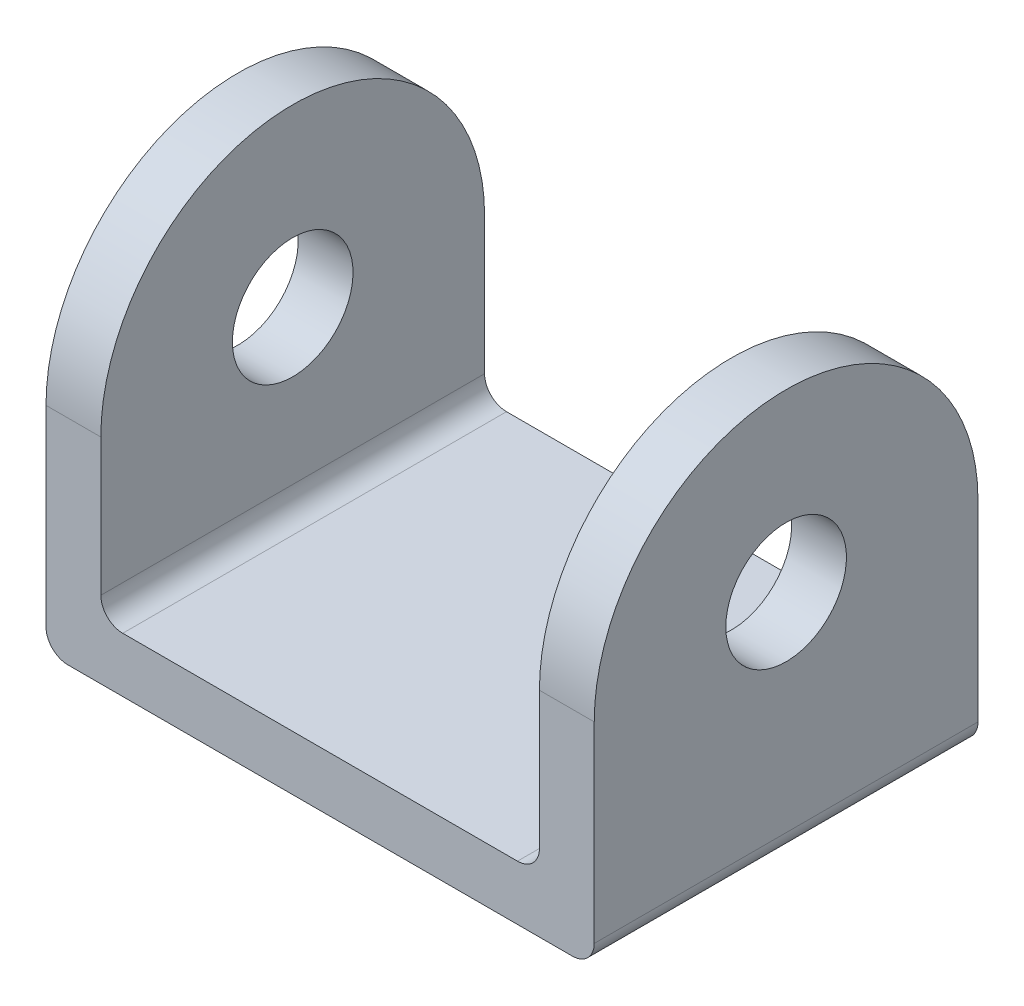
ISO-10303-21;
HEADER;
FILE_DESCRIPTION(('STEP AP214'),'2;1');
FILE_NAME('part.step','',(''),(''),'','','');
FILE_SCHEMA(('AUTOMOTIVE_DESIGN { 1 0 10303 214 1 1 1 1 }'));
ENDSEC;
DATA;
#1=APPLICATION_CONTEXT('core data for automotive mechanical design processes');
#2=APPLICATION_PROTOCOL_DEFINITION('international standard','automotive_design',2000,#1);
#3=PRODUCT_CONTEXT('',#1,'mechanical');
#4=PRODUCT('Part','Part','',(#3));
#5=PRODUCT_RELATED_PRODUCT_CATEGORY('part','',(#4));
#6=PRODUCT_DEFINITION_FORMATION('','',#4);
#7=PRODUCT_DEFINITION_CONTEXT('part definition',#1,'design');
#8=PRODUCT_DEFINITION('design','',#6,#7);
#9=PRODUCT_DEFINITION_SHAPE('','',#8);
#10=(LENGTH_UNIT() NAMED_UNIT(*) SI_UNIT(.MILLI.,.METRE.));
#11=(NAMED_UNIT(*) PLANE_ANGLE_UNIT() SI_UNIT($,.RADIAN.));
#12=(NAMED_UNIT(*) SI_UNIT($,.STERADIAN.) SOLID_ANGLE_UNIT());
#13=UNCERTAINTY_MEASURE_WITH_UNIT(LENGTH_MEASURE(1.E-05),#10,'distance_accuracy_value','');
#14=(GEOMETRIC_REPRESENTATION_CONTEXT(3) GLOBAL_UNCERTAINTY_ASSIGNED_CONTEXT((#13)) GLOBAL_UNIT_ASSIGNED_CONTEXT((#10,
#11,#12)) REPRESENTATION_CONTEXT('',''));
#15=CARTESIAN_POINT('',(0.,0.,0.));
#16=DIRECTION('',(0.,0.,1.));
#17=DIRECTION('',(1.,0.,0.));
#18=AXIS2_PLACEMENT_3D('',#15,#16,#17);
#19=CARTESIAN_POINT('',(-10.5198186826512,5.35080430037993,35.));
#20=DIRECTION('',(-1.,0.,0.));
#21=DIRECTION('',(0.,0.,1.));
#22=AXIS2_PLACEMENT_3D('',#19,#20,#21);
#23=PLANE('',#22);
#24=CARTESIAN_POINT('',(-10.5198186826512,19.3508043003799,17.5000000000001));
#25=DIRECTION('',(-1.,0.,0.));
#26=DIRECTION('',(0.,0.,1.));
#27=AXIS2_PLACEMENT_3D('',#24,#25,#26);
#28=CIRCLE('',#27,5.49999999999999);
#29=CARTESIAN_POINT('',(-10.5198186826512,19.3508043003799,23.0000000000001));
#30=VERTEX_POINT('',#29);
#31=EDGE_CURVE('E143',#30,#30,#28,.T.);
#32=ORIENTED_EDGE('',*,*,#31,.F.);
#33=EDGE_LOOP('',(#32));
#34=FACE_BOUND('',#33,.T.);
#35=DIRECTION('',(0.,1.,0.));
#36=VECTOR('',#35,1.);
#37=CARTESIAN_POINT('',(-10.5198186826512,5.35080430037993,35.));
#38=LINE('',#37,#36);
#39=CARTESIAN_POINT('',(-10.5198186826512,5.35080430037991,35.));
#40=VERTEX_POINT('',#39);
#41=CARTESIAN_POINT('',(-10.5198186826511,17.8508043003799,35.));
#42=VERTEX_POINT('',#41);
#43=EDGE_CURVE('E162',#40,#42,#38,.T.);
#44=ORIENTED_EDGE('',*,*,#43,.T.);
#45=CARTESIAN_POINT('',(-10.5198186826511,17.8508043003799,17.5));
#46=DIRECTION('',(-1.,0.,0.));
#47=DIRECTION('',(0.,0.,1.));
#48=AXIS2_PLACEMENT_3D('',#45,#46,#47);
#49=CIRCLE('',#48,17.5);
#50=CARTESIAN_POINT('',(-10.5198186826512,17.8508043003799,0.));
#51=VERTEX_POINT('',#50);
#52=EDGE_CURVE('E50',#42,#51,#49,.T.);
#53=ORIENTED_EDGE('',*,*,#52,.T.);
#54=DIRECTION('',(0.,1.,0.));
#55=VECTOR('',#54,1.);
#56=CARTESIAN_POINT('',(-10.5198186826512,5.35080430037993,0.));
#57=LINE('',#56,#55);
#58=CARTESIAN_POINT('',(-10.5198186826512,5.35080430037991,0.));
#59=VERTEX_POINT('',#58);
#60=EDGE_CURVE('E139',#59,#51,#57,.T.);
#61=ORIENTED_EDGE('',*,*,#60,.F.);
#62=DIRECTION('',(0.,0.,-1.));
#63=VECTOR('',#62,1.);
#64=CARTESIAN_POINT('',(-10.5198186826512,5.35080430037991,35.));
#65=LINE('',#64,#63);
#66=EDGE_CURVE('E11',#40,#59,#65,.T.);
#67=ORIENTED_EDGE('',*,*,#66,.F.);
#68=EDGE_LOOP('',(#44,#53,#61,#67));
#69=FACE_BOUND('',#68,.T.);
#70=ADVANCED_FACE('F34',(#34,#69),#23,.T.);
#71=CARTESIAN_POINT('',(-7.51981868265115,0.350804300379914,35.));
#72=DIRECTION('',(0.,0.,1.));
#73=DIRECTION('',(1.,0.,0.));
#74=AXIS2_PLACEMENT_3D('',#71,#72,#73);
#75=PLANE('',#74);
#76=DIRECTION('',(0.,1.,0.));
#77=VECTOR('',#76,1.);
#78=CARTESIAN_POINT('',(-5.51981868265115,0.350804300379929,35.));
#79=LINE('',#78,#77);
#80=CARTESIAN_POINT('',(-5.51981868265115,0.350804300379929,35.));
#81=VERTEX_POINT('',#80);
#82=CARTESIAN_POINT('',(-5.51981868265114,17.8508043003799,35.));
#83=VERTEX_POINT('',#82);
#84=EDGE_CURVE('E182',#81,#83,#79,.T.);
#85=ORIENTED_EDGE('',*,*,#84,.T.);
#86=DIRECTION('',(-1.,0.,0.));
#87=VECTOR('',#86,1.);
#88=CARTESIAN_POINT('',(139.945510717627,17.8508043003799,35.));
#89=LINE('',#88,#87);
#90=EDGE_CURVE('E193',#83,#42,#89,.T.);
#91=ORIENTED_EDGE('',*,*,#90,.T.);
#92=ORIENTED_EDGE('',*,*,#43,.F.);
#93=CARTESIAN_POINT('',(-12.5198186826512,5.35080430037991,35.));
#94=DIRECTION('',(0.,0.,1.));
#95=DIRECTION('',(1.,0.,0.));
#96=AXIS2_PLACEMENT_3D('',#93,#94,#95);
#97=CIRCLE('',#96,2.);
#98=CARTESIAN_POINT('',(-12.5198186826512,3.35080430037991,35.));
#99=VERTEX_POINT('',#98);
#100=EDGE_CURVE('E134',#99,#40,#97,.T.);
#101=ORIENTED_EDGE('',*,*,#100,.F.);
#102=DIRECTION('',(1.,0.,0.));
#103=VECTOR('',#102,1.);
#104=CARTESIAN_POINT('',(-48.5198186826511,3.35080430037991,35.));
#105=LINE('',#104,#103);
#106=CARTESIAN_POINT('',(-48.5198186826511,3.35080430037991,35.));
#107=VERTEX_POINT('',#106);
#108=EDGE_CURVE('E116',#107,#99,#105,.T.);
#109=ORIENTED_EDGE('',*,*,#108,.F.);
#110=CARTESIAN_POINT('',(-48.5198186826511,5.35080430037991,35.));
#111=DIRECTION('',(0.,0.,-1.));
#112=DIRECTION('',(-1.,0.,0.));
#113=AXIS2_PLACEMENT_3D('',#110,#111,#112);
#114=CIRCLE('',#113,2.);
#115=CARTESIAN_POINT('',(-50.5198186826511,5.35080430037993,35.));
#116=VERTEX_POINT('',#115);
#117=EDGE_CURVE('E127',#107,#116,#114,.T.);
#118=ORIENTED_EDGE('',*,*,#117,.T.);
#119=DIRECTION('',(0.,-1.,0.));
#120=VECTOR('',#119,1.);
#121=CARTESIAN_POINT('',(-50.5198186826512,35.3508043003799,35.));
#122=LINE('',#121,#120);
#123=CARTESIAN_POINT('',(-50.5198186826513,17.8508043003799,35.));
#124=VERTEX_POINT('',#123);
#125=EDGE_CURVE('E131',#124,#116,#122,.T.);
#126=ORIENTED_EDGE('',*,*,#125,.F.);
#127=DIRECTION('',(1.,0.,0.));
#128=VECTOR('',#127,1.);
#129=CARTESIAN_POINT('',(-200.985148082929,17.8508043003799,35.));
#130=LINE('',#129,#128);
#131=CARTESIAN_POINT('',(-55.5198186826512,17.8508043003799,35.));
#132=VERTEX_POINT('',#131);
#133=EDGE_CURVE('E204',#132,#124,#130,.T.);
#134=ORIENTED_EDGE('',*,*,#133,.F.);
#135=DIRECTION('',(0.,-1.,0.));
#136=VECTOR('',#135,1.);
#137=CARTESIAN_POINT('',(-55.5198186826512,35.3508043003799,35.));
#138=LINE('',#137,#136);
#139=CARTESIAN_POINT('',(-55.5198186826512,0.350804300379914,35.));
#140=VERTEX_POINT('',#139);
#141=EDGE_CURVE('E232',#132,#140,#138,.T.);
#142=ORIENTED_EDGE('',*,*,#141,.T.);
#143=CARTESIAN_POINT('',(-53.5198186826512,0.350804300379914,35.));
#144=DIRECTION('',(0.,0.,-1.));
#145=DIRECTION('',(-1.,0.,0.));
#146=AXIS2_PLACEMENT_3D('',#143,#144,#145);
#147=CIRCLE('',#146,2.);
#148=CARTESIAN_POINT('',(-53.5198186826511,-1.64919569962009,35.));
#149=VERTEX_POINT('',#148);
#150=EDGE_CURVE('E229',#149,#140,#147,.T.);
#151=ORIENTED_EDGE('',*,*,#150,.F.);
#152=DIRECTION('',(1.,0.,0.));
#153=VECTOR('',#152,1.);
#154=CARTESIAN_POINT('',(-53.5198186826511,-1.64919569962009,35.));
#155=LINE('',#154,#153);
#156=CARTESIAN_POINT('',(-7.51981868265117,-1.64919569962009,35.));
#157=VERTEX_POINT('',#156);
#158=EDGE_CURVE('E227',#149,#157,#155,.T.);
#159=ORIENTED_EDGE('',*,*,#158,.T.);
#160=CARTESIAN_POINT('',(-7.51981868265115,0.350804300379914,35.));
#161=DIRECTION('',(0.,0.,1.));
#162=DIRECTION('',(1.,0.,0.));
#163=AXIS2_PLACEMENT_3D('',#160,#161,#162);
#164=CIRCLE('',#163,2.);
#165=EDGE_CURVE('E94',#157,#81,#164,.T.);
#166=ORIENTED_EDGE('',*,*,#165,.T.);
#167=EDGE_LOOP('',(#85,#91,#92,#101,#109,#118,#126,#134,#142,#151,#159,#166));
#168=FACE_BOUND('',#167,.T.);
#169=ADVANCED_FACE('F133',(#168),#75,.T.);
#170=CARTESIAN_POINT('',(-7.51981868265115,0.350804300379914,0.));
#171=DIRECTION('',(0.,0.,1.));
#172=DIRECTION('',(1.,0.,0.));
#173=AXIS2_PLACEMENT_3D('',#170,#171,#172);
#174=PLANE('',#173);
#175=DIRECTION('',(-1.,0.,0.));
#176=VECTOR('',#175,1.);
#177=CARTESIAN_POINT('',(139.945510717627,17.8508043003799,0.));
#178=LINE('',#177,#176);
#179=CARTESIAN_POINT('',(-5.51981868265114,17.8508043003799,0.));
#180=VERTEX_POINT('',#179);
#181=EDGE_CURVE('E187',#180,#51,#178,.T.);
#182=ORIENTED_EDGE('',*,*,#181,.F.);
#183=DIRECTION('',(0.,1.,0.));
#184=VECTOR('',#183,1.);
#185=CARTESIAN_POINT('',(-5.51981868265115,0.350804300379929,0.));
#186=LINE('',#185,#184);
#187=CARTESIAN_POINT('',(-5.51981868265115,0.350804300379929,0.));
#188=VERTEX_POINT('',#187);
#189=EDGE_CURVE('E142',#188,#180,#186,.T.);
#190=ORIENTED_EDGE('',*,*,#189,.F.);
#191=CARTESIAN_POINT('',(-7.51981868265115,0.350804300379914,0.));
#192=DIRECTION('',(0.,0.,1.));
#193=DIRECTION('',(1.,0.,0.));
#194=AXIS2_PLACEMENT_3D('',#191,#192,#193);
#195=CIRCLE('',#194,2.);
#196=CARTESIAN_POINT('',(-7.51981868265117,-1.64919569962009,0.));
#197=VERTEX_POINT('',#196);
#198=EDGE_CURVE('E146',#197,#188,#195,.T.);
#199=ORIENTED_EDGE('',*,*,#198,.F.);
#200=DIRECTION('',(1.,0.,0.));
#201=VECTOR('',#200,1.);
#202=CARTESIAN_POINT('',(-53.5198186826511,-1.64919569962009,0.));
#203=LINE('',#202,#201);
#204=CARTESIAN_POINT('',(-53.5198186826511,-1.64919569962009,0.));
#205=VERTEX_POINT('',#204);
#206=EDGE_CURVE('E148',#205,#197,#203,.T.);
#207=ORIENTED_EDGE('',*,*,#206,.F.);
#208=CARTESIAN_POINT('',(-53.5198186826512,0.350804300379914,0.));
#209=DIRECTION('',(0.,0.,-1.));
#210=DIRECTION('',(-1.,0.,0.));
#211=AXIS2_PLACEMENT_3D('',#208,#209,#210);
#212=CIRCLE('',#211,2.);
#213=CARTESIAN_POINT('',(-55.5198186826512,0.350804300379914,0.));
#214=VERTEX_POINT('',#213);
#215=EDGE_CURVE('E150',#205,#214,#212,.T.);
#216=ORIENTED_EDGE('',*,*,#215,.T.);
#217=DIRECTION('',(0.,-1.,0.));
#218=VECTOR('',#217,1.);
#219=CARTESIAN_POINT('',(-55.5198186826512,35.3508043003799,0.));
#220=LINE('',#219,#218);
#221=CARTESIAN_POINT('',(-55.5198186826512,17.8508043003799,0.));
#222=VERTEX_POINT('',#221);
#223=EDGE_CURVE('E153',#222,#214,#220,.T.);
#224=ORIENTED_EDGE('',*,*,#223,.F.);
#225=DIRECTION('',(1.,0.,0.));
#226=VECTOR('',#225,1.);
#227=CARTESIAN_POINT('',(-200.985148082929,17.8508043003799,0.));
#228=LINE('',#227,#226);
#229=CARTESIAN_POINT('',(-50.5198186826513,17.8508043003799,0.));
#230=VERTEX_POINT('',#229);
#231=EDGE_CURVE('E207',#222,#230,#228,.T.);
#232=ORIENTED_EDGE('',*,*,#231,.T.);
#233=DIRECTION('',(0.,-1.,0.));
#234=VECTOR('',#233,1.);
#235=CARTESIAN_POINT('',(-50.5198186826512,35.3508043003799,0.));
#236=LINE('',#235,#234);
#237=CARTESIAN_POINT('',(-50.5198186826511,5.35080430037993,0.));
#238=VERTEX_POINT('',#237);
#239=EDGE_CURVE('E155',#230,#238,#236,.T.);
#240=ORIENTED_EDGE('',*,*,#239,.T.);
#241=CARTESIAN_POINT('',(-48.5198186826511,5.35080430037991,0.));
#242=DIRECTION('',(0.,0.,-1.));
#243=DIRECTION('',(-1.,0.,0.));
#244=AXIS2_PLACEMENT_3D('',#241,#242,#243);
#245=CIRCLE('',#244,2.);
#246=CARTESIAN_POINT('',(-48.5198186826511,3.35080430037991,0.));
#247=VERTEX_POINT('',#246);
#248=EDGE_CURVE('E157',#247,#238,#245,.T.);
#249=ORIENTED_EDGE('',*,*,#248,.F.);
#250=DIRECTION('',(1.,0.,0.));
#251=VECTOR('',#250,1.);
#252=CARTESIAN_POINT('',(-48.5198186826511,3.35080430037991,0.));
#253=LINE('',#252,#251);
#254=CARTESIAN_POINT('',(-12.5198186826512,3.35080430037991,0.));
#255=VERTEX_POINT('',#254);
#256=EDGE_CURVE('E119',#247,#255,#253,.T.);
#257=ORIENTED_EDGE('',*,*,#256,.T.);
#258=CARTESIAN_POINT('',(-12.5198186826512,5.35080430037991,0.));
#259=DIRECTION('',(0.,0.,1.));
#260=DIRECTION('',(1.,0.,0.));
#261=AXIS2_PLACEMENT_3D('',#258,#259,#260);
#262=CIRCLE('',#261,2.);
#263=EDGE_CURVE('E160',#255,#59,#262,.T.);
#264=ORIENTED_EDGE('',*,*,#263,.T.);
#265=ORIENTED_EDGE('',*,*,#60,.T.);
#266=EDGE_LOOP('',(#182,#190,#199,#207,#216,#224,#232,#240,#249,#257,#264,#265));
#267=FACE_BOUND('',#266,.T.);
#268=ADVANCED_FACE('F185',(#267),#174,.F.);
#269=CARTESIAN_POINT('',(-50.5198186826512,35.3508043003799,35.));
#270=DIRECTION('',(1.,0.,0.));
#271=DIRECTION('',(0.,1.,0.));
#272=AXIS2_PLACEMENT_3D('',#269,#270,#271);
#273=PLANE('',#272);
#274=CARTESIAN_POINT('',(-50.5198186826511,19.3508043003799,17.5000000000001));
#275=DIRECTION('',(1.,0.,0.));
#276=DIRECTION('',(0.,1.,0.));
#277=AXIS2_PLACEMENT_3D('',#274,#275,#276);
#278=CIRCLE('',#277,5.49999999999999);
#279=CARTESIAN_POINT('',(-50.5198186826511,24.8508043003799,17.5000000000001));
#280=VERTEX_POINT('',#279);
#281=EDGE_CURVE('E219',#280,#280,#278,.T.);
#282=ORIENTED_EDGE('',*,*,#281,.F.);
#283=EDGE_LOOP('',(#282));
#284=FACE_BOUND('',#283,.T.);
#285=CARTESIAN_POINT('',(-50.5198186826511,17.8508043003799,17.5));
#286=DIRECTION('',(1.,0.,0.));
#287=DIRECTION('',(0.,1.,0.));
#288=AXIS2_PLACEMENT_3D('',#285,#286,#287);
#289=CIRCLE('',#288,17.5);
#290=EDGE_CURVE('E210',#230,#124,#289,.T.);
#291=ORIENTED_EDGE('',*,*,#290,.T.);
#292=ORIENTED_EDGE('',*,*,#125,.T.);
#293=DIRECTION('',(0.,0.,-1.));
#294=VECTOR('',#293,1.);
#295=CARTESIAN_POINT('',(-50.5198186826511,5.35080430037993,35.));
#296=LINE('',#295,#294);
#297=EDGE_CURVE('E123',#116,#238,#296,.T.);
#298=ORIENTED_EDGE('',*,*,#297,.T.);
#299=ORIENTED_EDGE('',*,*,#239,.F.);
#300=EDGE_LOOP('',(#291,#292,#298,#299));
#301=FACE_BOUND('',#300,.T.);
#302=ADVANCED_FACE('F234',(#284,#301),#273,.T.);
#303=CARTESIAN_POINT('',(-12.5198186826512,5.35080430037991,35.));
#304=DIRECTION('',(0.,0.,-1.));
#305=DIRECTION('',(-1.,0.,0.));
#306=AXIS2_PLACEMENT_3D('',#303,#304,#305);
#307=CYLINDRICAL_SURFACE('',#306,2.);
#308=ORIENTED_EDGE('',*,*,#263,.F.);
#309=DIRECTION('',(0.,0.,-1.));
#310=VECTOR('',#309,1.);
#311=CARTESIAN_POINT('',(-12.5198186826512,3.35080430037991,35.));
#312=LINE('',#311,#310);
#313=EDGE_CURVE('E42',#99,#255,#312,.T.);
#314=ORIENTED_EDGE('',*,*,#313,.F.);
#315=ORIENTED_EDGE('',*,*,#100,.T.);
#316=ORIENTED_EDGE('',*,*,#66,.T.);
#317=EDGE_LOOP('',(#308,#314,#315,#316));
#318=FACE_BOUND('',#317,.T.);
#319=ADVANCED_FACE('F285',(#318),#307,.F.);
#320=CARTESIAN_POINT('',(-48.5198186826511,3.35080430037991,35.));
#321=DIRECTION('',(0.,1.,0.));
#322=DIRECTION('',(0.,0.,1.));
#323=AXIS2_PLACEMENT_3D('',#320,#321,#322);
#324=PLANE('',#323);
#325=ORIENTED_EDGE('',*,*,#256,.F.);
#326=DIRECTION('',(0.,0.,-1.));
#327=VECTOR('',#326,1.);
#328=CARTESIAN_POINT('',(-48.5198186826511,3.35080430037991,35.));
#329=LINE('',#328,#327);
#330=EDGE_CURVE('E112',#107,#247,#329,.T.);
#331=ORIENTED_EDGE('',*,*,#330,.F.);
#332=ORIENTED_EDGE('',*,*,#108,.T.);
#333=ORIENTED_EDGE('',*,*,#313,.T.);
#334=EDGE_LOOP('',(#325,#331,#332,#333));
#335=FACE_BOUND('',#334,.T.);
#336=ADVANCED_FACE('F114',(#335),#324,.T.);
#337=CARTESIAN_POINT('',(-48.5198186826511,5.35080430037991,35.));
#338=DIRECTION('',(0.,0.,-1.));
#339=DIRECTION('',(-1.,0.,0.));
#340=AXIS2_PLACEMENT_3D('',#337,#338,#339);
#341=CYLINDRICAL_SURFACE('',#340,2.);
#342=ORIENTED_EDGE('',*,*,#248,.T.);
#343=ORIENTED_EDGE('',*,*,#297,.F.);
#344=ORIENTED_EDGE('',*,*,#117,.F.);
#345=ORIENTED_EDGE('',*,*,#330,.T.);
#346=EDGE_LOOP('',(#342,#343,#344,#345));
#347=FACE_BOUND('',#346,.T.);
#348=ADVANCED_FACE('F128',(#347),#341,.F.);
#349=CARTESIAN_POINT('',(-55.5198186826512,35.3508043003799,35.));
#350=DIRECTION('',(1.,0.,0.));
#351=DIRECTION('',(0.,0.,-1.));
#352=AXIS2_PLACEMENT_3D('',#349,#350,#351);
#353=PLANE('',#352);
#354=CARTESIAN_POINT('',(-55.5198186826512,19.3508043003799,17.5000000000001));
#355=DIRECTION('',(-1.,0.,0.));
#356=DIRECTION('',(0.,0.,1.));
#357=AXIS2_PLACEMENT_3D('',#354,#355,#356);
#358=CIRCLE('',#357,5.49999999999999);
#359=CARTESIAN_POINT('',(-55.5198186826512,19.3508043003799,23.0000000000001));
#360=VERTEX_POINT('',#359);
#361=EDGE_CURVE('E213',#360,#360,#358,.T.);
#362=ORIENTED_EDGE('',*,*,#361,.F.);
#363=EDGE_LOOP('',(#362));
#364=FACE_BOUND('',#363,.T.);
#365=ORIENTED_EDGE('',*,*,#141,.F.);
#366=CARTESIAN_POINT('',(-55.5198186826512,17.8508043003799,17.5));
#367=DIRECTION('',(1.,0.,0.));
#368=DIRECTION('',(0.,0.,-1.));
#369=AXIS2_PLACEMENT_3D('',#366,#367,#368);
#370=CIRCLE('',#369,17.5);
#371=EDGE_CURVE('E201',#132,#222,#370,.F.);
#372=ORIENTED_EDGE('',*,*,#371,.T.);
#373=ORIENTED_EDGE('',*,*,#223,.T.);
#374=DIRECTION('',(0.,0.,-1.));
#375=VECTOR('',#374,1.);
#376=CARTESIAN_POINT('',(-55.5198186826512,0.350804300379914,35.));
#377=LINE('',#376,#375);
#378=EDGE_CURVE('E166',#140,#214,#377,.T.);
#379=ORIENTED_EDGE('',*,*,#378,.F.);
#380=EDGE_LOOP('',(#365,#372,#373,#379));
#381=FACE_BOUND('',#380,.T.);
#382=ADVANCED_FACE('F278',(#364,#381),#353,.F.);
#383=CARTESIAN_POINT('',(-53.5198186826512,0.350804300379914,35.));
#384=DIRECTION('',(0.,0.,-1.));
#385=DIRECTION('',(-1.,0.,0.));
#386=AXIS2_PLACEMENT_3D('',#383,#384,#385);
#387=CYLINDRICAL_SURFACE('',#386,2.);
#388=ORIENTED_EDGE('',*,*,#215,.F.);
#389=DIRECTION('',(0.,0.,-1.));
#390=VECTOR('',#389,1.);
#391=CARTESIAN_POINT('',(-53.5198186826511,-1.64919569962009,35.));
#392=LINE('',#391,#390);
#393=EDGE_CURVE('E169',#149,#205,#392,.T.);
#394=ORIENTED_EDGE('',*,*,#393,.F.);
#395=ORIENTED_EDGE('',*,*,#150,.T.);
#396=ORIENTED_EDGE('',*,*,#378,.T.);
#397=EDGE_LOOP('',(#388,#394,#395,#396));
#398=FACE_BOUND('',#397,.T.);
#399=ADVANCED_FACE('F274',(#398),#387,.T.);
#400=CARTESIAN_POINT('',(-53.5198186826511,-1.64919569962009,35.));
#401=DIRECTION('',(0.,1.,0.));
#402=DIRECTION('',(0.,0.,1.));
#403=AXIS2_PLACEMENT_3D('',#400,#401,#402);
#404=PLANE('',#403);
#405=ORIENTED_EDGE('',*,*,#206,.T.);
#406=DIRECTION('',(0.,0.,-1.));
#407=VECTOR('',#406,1.);
#408=CARTESIAN_POINT('',(-7.51981868265117,-1.64919569962009,35.));
#409=LINE('',#408,#407);
#410=EDGE_CURVE('E170',#157,#197,#409,.T.);
#411=ORIENTED_EDGE('',*,*,#410,.F.);
#412=ORIENTED_EDGE('',*,*,#158,.F.);
#413=ORIENTED_EDGE('',*,*,#393,.T.);
#414=EDGE_LOOP('',(#405,#411,#412,#413));
#415=FACE_BOUND('',#414,.T.);
#416=ADVANCED_FACE('F269',(#415),#404,.F.);
#417=CARTESIAN_POINT('',(-7.51981868265115,0.350804300379914,35.));
#418=DIRECTION('',(0.,0.,-1.));
#419=DIRECTION('',(-1.,0.,0.));
#420=AXIS2_PLACEMENT_3D('',#417,#418,#419);
#421=CYLINDRICAL_SURFACE('',#420,2.);
#422=ORIENTED_EDGE('',*,*,#198,.T.);
#423=DIRECTION('',(0.,0.,-1.));
#424=VECTOR('',#423,1.);
#425=CARTESIAN_POINT('',(-5.51981868265115,0.350804300379929,35.));
#426=LINE('',#425,#424);
#427=EDGE_CURVE('E37',#81,#188,#426,.T.);
#428=ORIENTED_EDGE('',*,*,#427,.F.);
#429=ORIENTED_EDGE('',*,*,#165,.F.);
#430=ORIENTED_EDGE('',*,*,#410,.T.);
#431=EDGE_LOOP('',(#422,#428,#429,#430));
#432=FACE_BOUND('',#431,.T.);
#433=ADVANCED_FACE('F265',(#432),#421,.T.);
#434=CARTESIAN_POINT('',(-5.51981868265115,0.350804300379929,35.));
#435=DIRECTION('',(-1.,0.,0.));
#436=DIRECTION('',(0.,0.,1.));
#437=AXIS2_PLACEMENT_3D('',#434,#435,#436);
#438=PLANE('',#437);
#439=CARTESIAN_POINT('',(-5.51981868265115,19.3508043003799,17.5000000000001));
#440=DIRECTION('',(-1.,0.,0.));
#441=DIRECTION('',(0.,0.,1.));
#442=AXIS2_PLACEMENT_3D('',#439,#440,#441);
#443=CIRCLE('',#442,5.49999999999999);
#444=CARTESIAN_POINT('',(-5.51981868265115,19.3508043003799,23.0000000000001));
#445=VERTEX_POINT('',#444);
#446=EDGE_CURVE('E216',#445,#445,#443,.T.);
#447=ORIENTED_EDGE('',*,*,#446,.T.);
#448=EDGE_LOOP('',(#447));
#449=FACE_BOUND('',#448,.T.);
#450=ORIENTED_EDGE('',*,*,#189,.T.);
#451=CARTESIAN_POINT('',(-5.51981868265114,17.8508043003799,17.5));
#452=DIRECTION('',(-1.,0.,0.));
#453=DIRECTION('',(0.,0.,1.));
#454=AXIS2_PLACEMENT_3D('',#451,#452,#453);
#455=CIRCLE('',#454,17.5);
#456=EDGE_CURVE('E194',#180,#83,#455,.F.);
#457=ORIENTED_EDGE('',*,*,#456,.T.);
#458=ORIENTED_EDGE('',*,*,#84,.F.);
#459=ORIENTED_EDGE('',*,*,#427,.T.);
#460=EDGE_LOOP('',(#450,#457,#458,#459));
#461=FACE_BOUND('',#460,.T.);
#462=ADVANCED_FACE('F179',(#449,#461),#438,.F.);
#463=CARTESIAN_POINT('',(-55.5198186826512,19.3508043003799,17.5000000000001));
#464=DIRECTION('',(-1.,0.,0.));
#465=DIRECTION('',(0.,0.,1.));
#466=AXIS2_PLACEMENT_3D('',#463,#464,#465);
#467=CYLINDRICAL_SURFACE('',#466,5.49999999999999);
#468=ORIENTED_EDGE('',*,*,#31,.T.);
#469=EDGE_LOOP('',(#468));
#470=FACE_BOUND('',#469,.T.);
#471=ORIENTED_EDGE('',*,*,#446,.F.);
#472=EDGE_LOOP('',(#471));
#473=FACE_BOUND('',#472,.T.);
#474=ADVANCED_FACE('F257',(#470,#473),#467,.F.);
#475=ORIENTED_EDGE('',*,*,#281,.T.);
#476=EDGE_LOOP('',(#475));
#477=FACE_BOUND('',#476,.T.);
#478=ORIENTED_EDGE('',*,*,#361,.T.);
#479=EDGE_LOOP('',(#478));
#480=FACE_BOUND('',#479,.T.);
#481=ADVANCED_FACE('F260',(#477,#480),#467,.F.);
#482=CARTESIAN_POINT('',(-200.985148082929,17.8508043003799,17.5));
#483=DIRECTION('',(1.,0.,0.));
#484=DIRECTION('',(0.,0.,-1.));
#485=AXIS2_PLACEMENT_3D('',#482,#483,#484);
#486=CYLINDRICAL_SURFACE('',#485,17.5);
#487=ORIENTED_EDGE('',*,*,#133,.T.);
#488=ORIENTED_EDGE('',*,*,#290,.F.);
#489=ORIENTED_EDGE('',*,*,#231,.F.);
#490=ORIENTED_EDGE('',*,*,#371,.F.);
#491=EDGE_LOOP('',(#487,#488,#489,#490));
#492=FACE_BOUND('',#491,.T.);
#493=ADVANCED_FACE('F296',(#492),#486,.T.);
#494=CARTESIAN_POINT('',(139.945510717627,17.8508043003799,17.5));
#495=DIRECTION('',(-1.,0.,0.));
#496=DIRECTION('',(0.,0.,1.));
#497=AXIS2_PLACEMENT_3D('',#494,#495,#496);
#498=CYLINDRICAL_SURFACE('',#497,17.5);
#499=ORIENTED_EDGE('',*,*,#52,.F.);
#500=ORIENTED_EDGE('',*,*,#90,.F.);
#501=ORIENTED_EDGE('',*,*,#456,.F.);
#502=ORIENTED_EDGE('',*,*,#181,.T.);
#503=EDGE_LOOP('',(#499,#500,#501,#502));
#504=FACE_BOUND('',#503,.T.);
#505=ADVANCED_FACE('F248',(#504),#498,.T.);
#506=CLOSED_SHELL('',(#70,#169,#268,#302,#319,#336,#348,#382,#399,#416,#433,#462,#474,#481,#493,#505));
#507=MANIFOLD_SOLID_BREP('B2',#506);
#508=ADVANCED_BREP_SHAPE_REPRESENTATION('',(#18,#507),#14);
#509=SHAPE_DEFINITION_REPRESENTATION(#9,#508);
ENDSEC;
END-ISO-10303-21;
